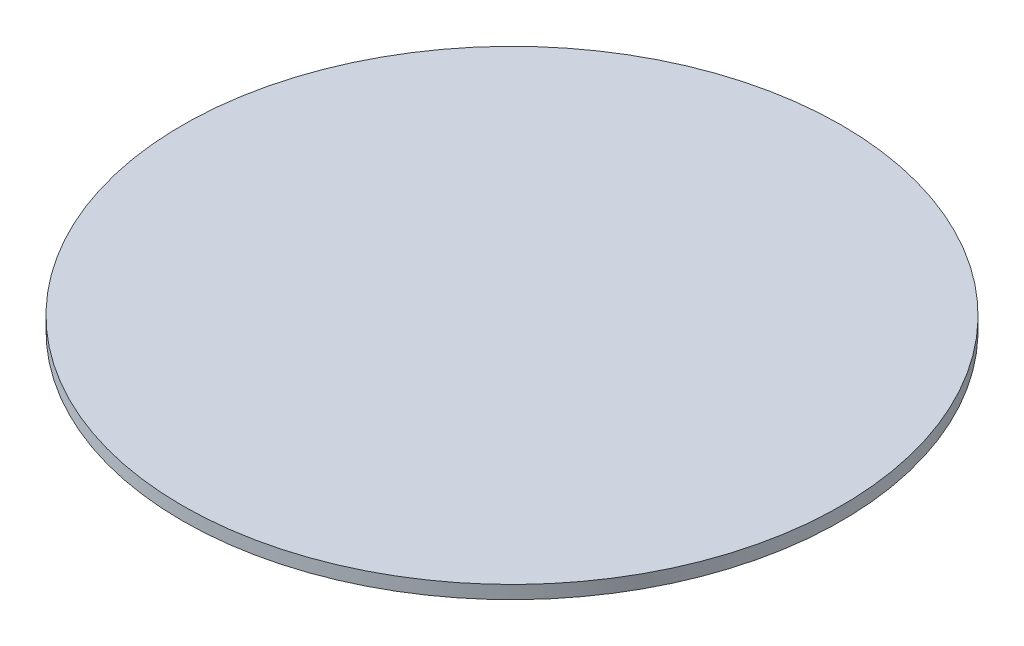
ISO-10303-21;
HEADER;
FILE_DESCRIPTION(('STEP AP214'),'2;1');
FILE_NAME('part.step','',(''),(''),'','','');
FILE_SCHEMA(('AUTOMOTIVE_DESIGN { 1 0 10303 214 1 1 1 1 }'));
ENDSEC;
DATA;
#1=APPLICATION_CONTEXT('core data for automotive mechanical design processes');
#2=APPLICATION_PROTOCOL_DEFINITION('international standard','automotive_design',2000,#1);
#3=PRODUCT_CONTEXT('',#1,'mechanical');
#4=PRODUCT('Part','Part','',(#3));
#5=PRODUCT_RELATED_PRODUCT_CATEGORY('part','',(#4));
#6=PRODUCT_DEFINITION_FORMATION('','',#4);
#7=PRODUCT_DEFINITION_CONTEXT('part definition',#1,'design');
#8=PRODUCT_DEFINITION('design','',#6,#7);
#9=PRODUCT_DEFINITION_SHAPE('','',#8);
#10=(LENGTH_UNIT() NAMED_UNIT(*) SI_UNIT(.MILLI.,.METRE.));
#11=(NAMED_UNIT(*) PLANE_ANGLE_UNIT() SI_UNIT($,.RADIAN.));
#12=(NAMED_UNIT(*) SI_UNIT($,.STERADIAN.) SOLID_ANGLE_UNIT());
#13=UNCERTAINTY_MEASURE_WITH_UNIT(LENGTH_MEASURE(1.E-05),#10,'distance_accuracy_value','');
#14=(GEOMETRIC_REPRESENTATION_CONTEXT(3) GLOBAL_UNCERTAINTY_ASSIGNED_CONTEXT((#13)) GLOBAL_UNIT_ASSIGNED_CONTEXT((#10,
#11,#12)) REPRESENTATION_CONTEXT('',''));
#15=CARTESIAN_POINT('',(0.,0.,0.));
#16=DIRECTION('',(0.,0.,1.));
#17=DIRECTION('',(1.,0.,0.));
#18=AXIS2_PLACEMENT_3D('',#15,#16,#17);
#19=CARTESIAN_POINT('',(0.,1.,0.));
#20=DIRECTION('',(0.,-1.,0.));
#21=DIRECTION('',(0.,0.,-1.));
#22=AXIS2_PLACEMENT_3D('',#19,#20,#21);
#23=CYLINDRICAL_SURFACE('',#22,25.);
#24=CARTESIAN_POINT('',(0.,1.,0.));
#25=DIRECTION('',(0.,1.,0.));
#26=DIRECTION('',(0.,0.,1.));
#27=AXIS2_PLACEMENT_3D('',#24,#25,#26);
#28=CIRCLE('',#27,25.);
#29=CARTESIAN_POINT('',(0.,1.,25.));
#30=VERTEX_POINT('',#29);
#31=EDGE_CURVE('E10',#30,#30,#28,.T.);
#32=ORIENTED_EDGE('',*,*,#31,.F.);
#33=EDGE_LOOP('',(#32));
#34=FACE_BOUND('',#33,.T.);
#35=CARTESIAN_POINT('',(0.,0.,0.));
#36=DIRECTION('',(0.,1.,0.));
#37=DIRECTION('',(0.,0.,1.));
#38=AXIS2_PLACEMENT_3D('',#35,#36,#37);
#39=CIRCLE('',#38,25.);
#40=CARTESIAN_POINT('',(0.,0.,25.));
#41=VERTEX_POINT('',#40);
#42=EDGE_CURVE('E37',#41,#41,#39,.T.);
#43=ORIENTED_EDGE('',*,*,#42,.T.);
#44=EDGE_LOOP('',(#43));
#45=FACE_BOUND('',#44,.T.);
#46=ADVANCED_FACE('F34',(#34,#45),#23,.T.);
#47=CARTESIAN_POINT('',(0.,1.,0.));
#48=DIRECTION('',(0.,1.,0.));
#49=DIRECTION('',(0.,0.,1.));
#50=AXIS2_PLACEMENT_3D('',#47,#48,#49);
#51=PLANE('',#50);
#52=ORIENTED_EDGE('',*,*,#31,.T.);
#53=EDGE_LOOP('',(#52));
#54=FACE_BOUND('',#53,.T.);
#55=ADVANCED_FACE('F49',(#54),#51,.T.);
#56=CARTESIAN_POINT('',(0.,0.,0.));
#57=DIRECTION('',(0.,1.,0.));
#58=DIRECTION('',(0.,0.,1.));
#59=AXIS2_PLACEMENT_3D('',#56,#57,#58);
#60=PLANE('',#59);
#61=ORIENTED_EDGE('',*,*,#42,.F.);
#62=EDGE_LOOP('',(#61));
#63=FACE_BOUND('',#62,.T.);
#64=ADVANCED_FACE('F47',(#63),#60,.F.);
#65=CLOSED_SHELL('',(#46,#55,#64));
#66=MANIFOLD_SOLID_BREP('B2',#65);
#67=ADVANCED_BREP_SHAPE_REPRESENTATION('',(#18,#66),#14);
#68=SHAPE_DEFINITION_REPRESENTATION(#9,#67);
ENDSEC;
END-ISO-10303-21;
